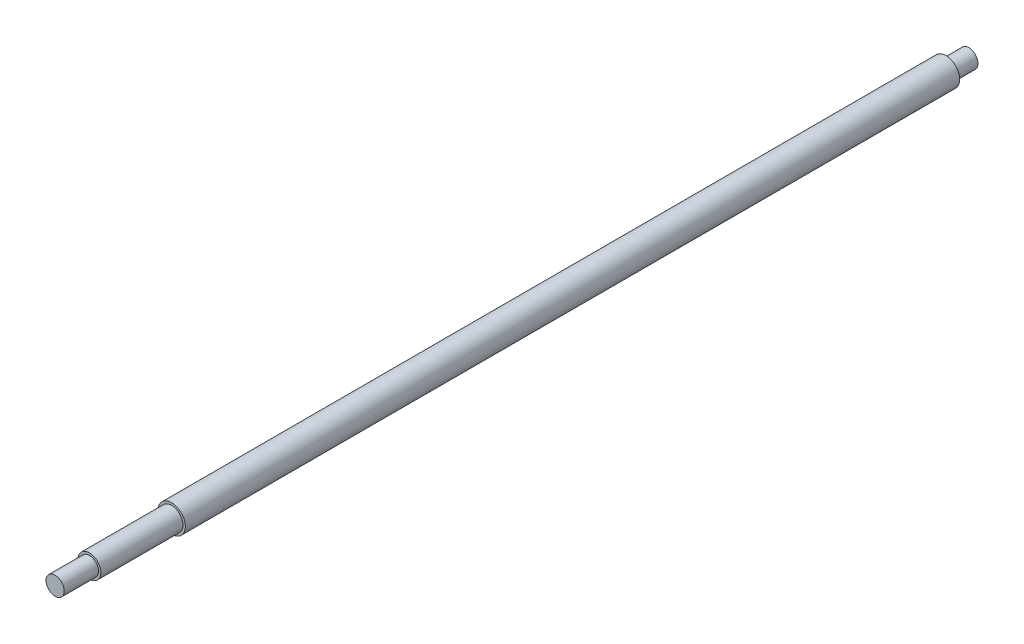
ISO-10303-21;
HEADER;
FILE_DESCRIPTION(('STEP AP214'),'2;1');
FILE_NAME('part.step','',(''),(''),'','','');
FILE_SCHEMA(('AUTOMOTIVE_DESIGN { 1 0 10303 214 1 1 1 1 }'));
ENDSEC;
DATA;
#1=APPLICATION_CONTEXT('core data for automotive mechanical design processes');
#2=APPLICATION_PROTOCOL_DEFINITION('international standard','automotive_design',2000,#1);
#3=PRODUCT_CONTEXT('',#1,'mechanical');
#4=PRODUCT('Part','Part','',(#3));
#5=PRODUCT_RELATED_PRODUCT_CATEGORY('part','',(#4));
#6=PRODUCT_DEFINITION_FORMATION('','',#4);
#7=PRODUCT_DEFINITION_CONTEXT('part definition',#1,'design');
#8=PRODUCT_DEFINITION('design','',#6,#7);
#9=PRODUCT_DEFINITION_SHAPE('','',#8);
#10=(LENGTH_UNIT() NAMED_UNIT(*) SI_UNIT(.MILLI.,.METRE.));
#11=(NAMED_UNIT(*) PLANE_ANGLE_UNIT() SI_UNIT($,.RADIAN.));
#12=(NAMED_UNIT(*) SI_UNIT($,.STERADIAN.) SOLID_ANGLE_UNIT());
#13=UNCERTAINTY_MEASURE_WITH_UNIT(LENGTH_MEASURE(1.E-05),#10,'distance_accuracy_value','');
#14=(GEOMETRIC_REPRESENTATION_CONTEXT(3) GLOBAL_UNCERTAINTY_ASSIGNED_CONTEXT((#13)) GLOBAL_UNIT_ASSIGNED_CONTEXT((#10,
#11,#12)) REPRESENTATION_CONTEXT('',''));
#15=CARTESIAN_POINT('',(0.,0.,0.));
#16=DIRECTION('',(0.,0.,1.));
#17=DIRECTION('',(1.,0.,0.));
#18=AXIS2_PLACEMENT_3D('',#15,#16,#17);
#19=CARTESIAN_POINT('',(0.,0.,400.));
#20=DIRECTION('',(0.,0.,-1.));
#21=DIRECTION('',(-1.,0.,0.));
#22=AXIS2_PLACEMENT_3D('',#19,#20,#21);
#23=CYLINDRICAL_SURFACE('',#22,6.);
#24=CARTESIAN_POINT('',(0.,0.,349.));
#25=DIRECTION('',(0.,0.,1.));
#26=DIRECTION('',(1.,0.,0.));
#27=AXIS2_PLACEMENT_3D('',#24,#25,#26);
#28=CIRCLE('',#27,6.);
#29=CARTESIAN_POINT('',(6.,0.,349.));
#30=VERTEX_POINT('',#29);
#31=EDGE_CURVE('E11',#30,#30,#28,.T.);
#32=ORIENTED_EDGE('',*,*,#31,.F.);
#33=EDGE_LOOP('',(#32));
#34=FACE_BOUND('',#33,.T.);
#35=CARTESIAN_POINT('',(0.,0.,10.));
#36=DIRECTION('',(0.,0.,-1.));
#37=DIRECTION('',(-1.,0.,0.));
#38=AXIS2_PLACEMENT_3D('',#35,#36,#37);
#39=CIRCLE('',#38,6.);
#40=CARTESIAN_POINT('',(-6.,0.,10.));
#41=VERTEX_POINT('',#40);
#42=EDGE_CURVE('E38',#41,#41,#39,.T.);
#43=ORIENTED_EDGE('',*,*,#42,.F.);
#44=EDGE_LOOP('',(#43));
#45=FACE_BOUND('',#44,.T.);
#46=ADVANCED_FACE('F35',(#34,#45),#23,.T.);
#47=CARTESIAN_POINT('',(0.,0.,349.));
#48=DIRECTION('',(0.,0.,1.));
#49=DIRECTION('',(1.,0.,0.));
#50=AXIS2_PLACEMENT_3D('',#47,#48,#49);
#51=CYLINDRICAL_SURFACE('',#50,5.);
#52=CARTESIAN_POINT('',(0.,0.,349.));
#53=DIRECTION('',(0.,0.,1.));
#54=DIRECTION('',(1.,0.,0.));
#55=AXIS2_PLACEMENT_3D('',#52,#53,#54);
#56=CIRCLE('',#55,5.);
#57=CARTESIAN_POINT('',(5.,0.,349.));
#58=VERTEX_POINT('',#57);
#59=EDGE_CURVE('E42',#58,#58,#56,.T.);
#60=ORIENTED_EDGE('',*,*,#59,.T.);
#61=EDGE_LOOP('',(#60));
#62=FACE_BOUND('',#61,.T.);
#63=CARTESIAN_POINT('',(0.,0.,385.));
#64=DIRECTION('',(0.,0.,1.));
#65=DIRECTION('',(1.,0.,0.));
#66=AXIS2_PLACEMENT_3D('',#63,#64,#65);
#67=CIRCLE('',#66,5.);
#68=CARTESIAN_POINT('',(5.,0.,385.));
#69=VERTEX_POINT('',#68);
#70=EDGE_CURVE('E47',#69,#69,#67,.F.);
#71=ORIENTED_EDGE('',*,*,#70,.T.);
#72=EDGE_LOOP('',(#71));
#73=FACE_BOUND('',#72,.T.);
#74=ADVANCED_FACE('F74',(#62,#73),#51,.T.);
#75=CARTESIAN_POINT('',(0.,0.,349.));
#76=DIRECTION('',(0.,0.,1.));
#77=DIRECTION('',(1.,0.,0.));
#78=AXIS2_PLACEMENT_3D('',#75,#76,#77);
#79=PLANE('',#78);
#80=ORIENTED_EDGE('',*,*,#59,.F.);
#81=EDGE_LOOP('',(#80));
#82=FACE_BOUND('',#81,.T.);
#83=ORIENTED_EDGE('',*,*,#31,.T.);
#84=EDGE_LOOP('',(#83));
#85=FACE_BOUND('',#84,.T.);
#86=ADVANCED_FACE('F79',(#82,#85),#79,.T.);
#87=CARTESIAN_POINT('',(0.,0.,385.));
#88=DIRECTION('',(0.,0.,1.));
#89=DIRECTION('',(1.,0.,0.));
#90=AXIS2_PLACEMENT_3D('',#87,#88,#89);
#91=PLANE('',#90);
#92=ORIENTED_EDGE('',*,*,#70,.F.);
#93=EDGE_LOOP('',(#92));
#94=FACE_BOUND('',#93,.T.);
#95=CARTESIAN_POINT('',(0.,0.,385.));
#96=DIRECTION('',(0.,0.,1.));
#97=DIRECTION('',(1.,0.,0.));
#98=AXIS2_PLACEMENT_3D('',#95,#96,#97);
#99=CIRCLE('',#98,4.);
#100=CARTESIAN_POINT('',(4.,0.,385.));
#101=VERTEX_POINT('',#100);
#102=EDGE_CURVE('E51',#101,#101,#99,.T.);
#103=ORIENTED_EDGE('',*,*,#102,.F.);
#104=EDGE_LOOP('',(#103));
#105=FACE_BOUND('',#104,.T.);
#106=ADVANCED_FACE('F85',(#94,#105),#91,.T.);
#107=CARTESIAN_POINT('',(0.,0.,385.));
#108=DIRECTION('',(0.,0.,1.));
#109=DIRECTION('',(1.,0.,0.));
#110=AXIS2_PLACEMENT_3D('',#107,#108,#109);
#111=CYLINDRICAL_SURFACE('',#110,4.);
#112=ORIENTED_EDGE('',*,*,#102,.T.);
#113=EDGE_LOOP('',(#112));
#114=FACE_BOUND('',#113,.T.);
#115=CARTESIAN_POINT('',(0.,0.,400.));
#116=DIRECTION('',(0.,0.,1.));
#117=DIRECTION('',(1.,0.,0.));
#118=AXIS2_PLACEMENT_3D('',#115,#116,#117);
#119=CIRCLE('',#118,4.);
#120=CARTESIAN_POINT('',(4.,0.,400.));
#121=VERTEX_POINT('',#120);
#122=EDGE_CURVE('E55',#121,#121,#119,.T.);
#123=ORIENTED_EDGE('',*,*,#122,.F.);
#124=EDGE_LOOP('',(#123));
#125=FACE_BOUND('',#124,.T.);
#126=ADVANCED_FACE('F93',(#114,#125),#111,.T.);
#127=CARTESIAN_POINT('',(0.,0.,400.));
#128=DIRECTION('',(0.,0.,1.));
#129=DIRECTION('',(1.,0.,0.));
#130=AXIS2_PLACEMENT_3D('',#127,#128,#129);
#131=PLANE('',#130);
#132=ORIENTED_EDGE('',*,*,#122,.T.);
#133=EDGE_LOOP('',(#132));
#134=FACE_BOUND('',#133,.T.);
#135=ADVANCED_FACE('F91',(#134),#131,.T.);
#136=CARTESIAN_POINT('',(0.,0.,10.));
#137=DIRECTION('',(0.,0.,-1.));
#138=DIRECTION('',(-1.,0.,0.));
#139=AXIS2_PLACEMENT_3D('',#136,#137,#138);
#140=PLANE('',#139);
#141=CARTESIAN_POINT('',(0.,0.,10.));
#142=DIRECTION('',(0.,0.,-1.));
#143=DIRECTION('',(-1.,0.,0.));
#144=AXIS2_PLACEMENT_3D('',#141,#142,#143);
#145=CIRCLE('',#144,4.);
#146=CARTESIAN_POINT('',(-4.,0.,10.));
#147=VERTEX_POINT('',#146);
#148=EDGE_CURVE('E64',#147,#147,#145,.T.);
#149=ORIENTED_EDGE('',*,*,#148,.F.);
#150=EDGE_LOOP('',(#149));
#151=FACE_BOUND('',#150,.T.);
#152=ORIENTED_EDGE('',*,*,#42,.T.);
#153=EDGE_LOOP('',(#152));
#154=FACE_BOUND('',#153,.T.);
#155=ADVANCED_FACE('F71',(#151,#154),#140,.T.);
#156=CARTESIAN_POINT('',(0.,0.,10.));
#157=DIRECTION('',(0.,0.,-1.));
#158=DIRECTION('',(-1.,0.,0.));
#159=AXIS2_PLACEMENT_3D('',#156,#157,#158);
#160=CYLINDRICAL_SURFACE('',#159,4.);
#161=ORIENTED_EDGE('',*,*,#148,.T.);
#162=EDGE_LOOP('',(#161));
#163=FACE_BOUND('',#162,.T.);
#164=CARTESIAN_POINT('',(0.,0.,0.));
#165=DIRECTION('',(0.,0.,-1.));
#166=DIRECTION('',(-1.,0.,0.));
#167=AXIS2_PLACEMENT_3D('',#164,#165,#166);
#168=CIRCLE('',#167,4.);
#169=CARTESIAN_POINT('',(-4.,0.,0.));
#170=VERTEX_POINT('',#169);
#171=EDGE_CURVE('E61',#170,#170,#168,.T.);
#172=ORIENTED_EDGE('',*,*,#171,.F.);
#173=EDGE_LOOP('',(#172));
#174=FACE_BOUND('',#173,.T.);
#175=ADVANCED_FACE('F97',(#163,#174),#160,.T.);
#176=CARTESIAN_POINT('',(0.,0.,0.));
#177=DIRECTION('',(0.,0.,1.));
#178=DIRECTION('',(1.,0.,0.));
#179=AXIS2_PLACEMENT_3D('',#176,#177,#178);
#180=PLANE('',#179);
#181=ORIENTED_EDGE('',*,*,#171,.T.);
#182=EDGE_LOOP('',(#181));
#183=FACE_BOUND('',#182,.T.);
#184=ADVANCED_FACE('F95',(#183),#180,.F.);
#185=CLOSED_SHELL('',(#46,#74,#86,#106,#126,#135,#155,#175,#184));
#186=MANIFOLD_SOLID_BREP('B2',#185);
#187=ADVANCED_BREP_SHAPE_REPRESENTATION('',(#18,#186),#14);
#188=SHAPE_DEFINITION_REPRESENTATION(#9,#187);
ENDSEC;
END-ISO-10303-21;
